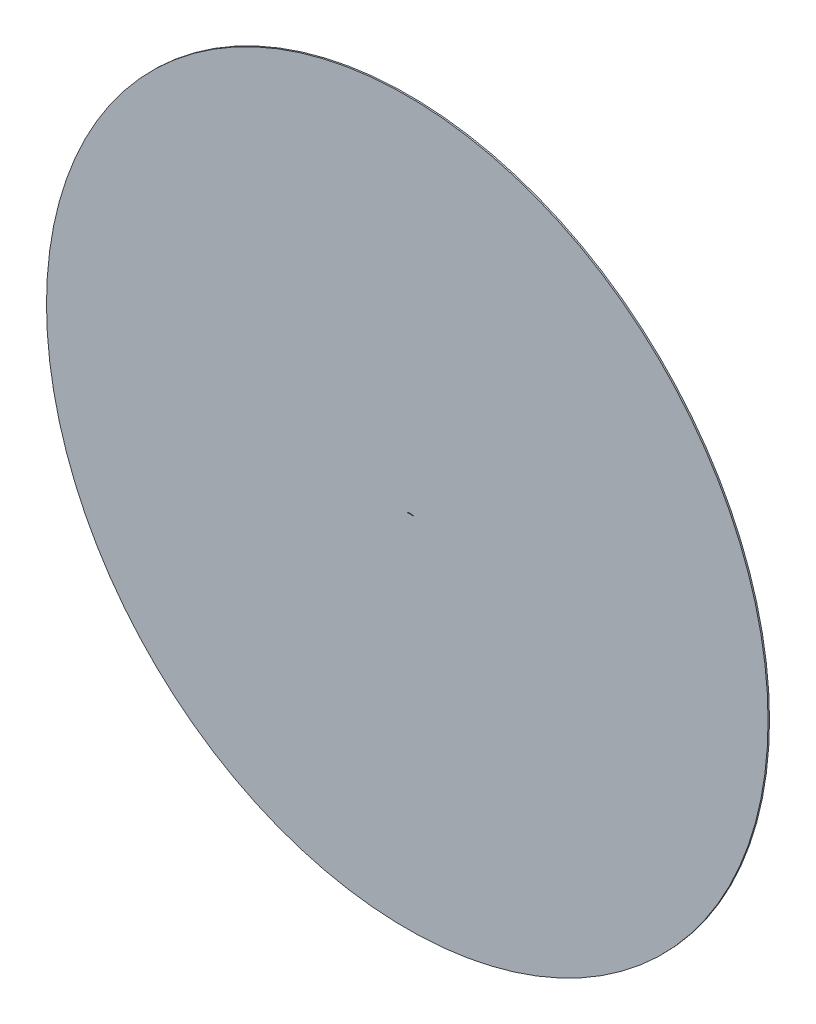
ISO-10303-21;
HEADER;
FILE_DESCRIPTION(('STEP AP214'),'2;1');
FILE_NAME('part.step','',(''),(''),'','','');
FILE_SCHEMA(('AUTOMOTIVE_DESIGN { 1 0 10303 214 1 1 1 1 }'));
ENDSEC;
DATA;
#1=APPLICATION_CONTEXT('core data for automotive mechanical design processes');
#2=APPLICATION_PROTOCOL_DEFINITION('international standard','automotive_design',2000,#1);
#3=PRODUCT_CONTEXT('',#1,'mechanical');
#4=PRODUCT('Part','Part','',(#3));
#5=PRODUCT_RELATED_PRODUCT_CATEGORY('part','',(#4));
#6=PRODUCT_DEFINITION_FORMATION('','',#4);
#7=PRODUCT_DEFINITION_CONTEXT('part definition',#1,'design');
#8=PRODUCT_DEFINITION('design','',#6,#7);
#9=PRODUCT_DEFINITION_SHAPE('','',#8);
#10=(LENGTH_UNIT() NAMED_UNIT(*) SI_UNIT(.MILLI.,.METRE.));
#11=(NAMED_UNIT(*) PLANE_ANGLE_UNIT() SI_UNIT($,.RADIAN.));
#12=(NAMED_UNIT(*) SI_UNIT($,.STERADIAN.) SOLID_ANGLE_UNIT());
#13=UNCERTAINTY_MEASURE_WITH_UNIT(LENGTH_MEASURE(1.E-05),#10,'distance_accuracy_value','');
#14=(GEOMETRIC_REPRESENTATION_CONTEXT(3) GLOBAL_UNCERTAINTY_ASSIGNED_CONTEXT((#13)) GLOBAL_UNIT_ASSIGNED_CONTEXT((#10,
#11,#12)) REPRESENTATION_CONTEXT('',''));
#15=CARTESIAN_POINT('',(0.,0.,0.));
#16=DIRECTION('',(0.,0.,1.));
#17=DIRECTION('',(1.,0.,0.));
#18=AXIS2_PLACEMENT_3D('',#15,#16,#17);
#19=CARTESIAN_POINT('',(0.,0.,30.));
#20=DIRECTION('',(0.,0.,1.));
#21=DIRECTION('',(1.,0.,0.));
#22=AXIS2_PLACEMENT_3D('',#19,#20,#21);
#23=PLANE('',#22);
#24=CARTESIAN_POINT('',(0.,0.,30.));
#25=DIRECTION('',(0.,0.,1.));
#26=DIRECTION('',(1.,0.,0.));
#27=AXIS2_PLACEMENT_3D('',#24,#25,#26);
#28=CIRCLE('',#27,15000.);
#29=CARTESIAN_POINT('',(15000.,0.,30.));
#30=VERTEX_POINT('',#29);
#31=EDGE_CURVE('E10',#30,#30,#28,.T.);
#32=ORIENTED_EDGE('',*,*,#31,.T.);
#33=EDGE_LOOP('',(#32));
#34=FACE_BOUND('',#33,.T.);
#35=CARTESIAN_POINT('',(300.,0.,30.));
#36=CARTESIAN_POINT('',(300.00040281126,0.0178912311711619,30.));
#37=CARTESIAN_POINT('',(297.856859750338,0.292445736117603,30.));
#38=CARTESIAN_POINT('',(295.723511165293,0.726892038601411,30.));
#39=CARTESIAN_POINT('',(290.679302282304,1.67948042122938,30.));
#40=CARTESIAN_POINT('',(284.635959686564,2.89737428072367,30.));
#41=CARTESIAN_POINT('',(276.87987904583,4.34451547557609,30.));
#42=CARTESIAN_POINT('',(267.820428047674,5.95277122047384,30.));
#43=CARTESIAN_POINT('',(257.455385672593,7.74224419698835,30.));
#44=CARTESIAN_POINT('',(245.967842138554,9.7066181298092,30.));
#45=CARTESIAN_POINT('',(233.506042755824,11.7912664082305,30.));
#46=CARTESIAN_POINT('',(220.251698882361,13.9739213882839,30.));
#47=CARTESIAN_POINT('',(206.381961989243,16.1816841890771,30.));
#48=CARTESIAN_POINT('',(192.087853073807,18.3684631142761,30.));
#49=CARTESIAN_POINT('',(177.558664746052,20.4566072205481,30.));
#50=CARTESIAN_POINT('',(162.970058246325,22.3599488554891,30.));
#51=CARTESIAN_POINT('',(148.455715133973,23.9244823538037,30.));
#52=CARTESIAN_POINT('',(134.124604137652,25.0697110511451,30.));
#53=CARTESIAN_POINT('',(120.062244475449,25.7341360546162,30.));
#54=CARTESIAN_POINT('',(106.348271384697,25.8979757807121,30.));
#55=CARTESIAN_POINT('',(93.0557110970717,25.5553915699274,30.));
#56=CARTESIAN_POINT('',(80.265928232374,24.7293055201625,30.));
#57=CARTESIAN_POINT('',(68.072226575361,23.5171246441329,30.));
#58=CARTESIAN_POINT('',(56.5871963367384,21.9624268561274,30.));
#59=CARTESIAN_POINT('',(45.9259917592067,20.1177795793824,30.));
#60=CARTESIAN_POINT('',(36.1959543757953,18.0184956263386,30.));
#61=CARTESIAN_POINT('',(27.4876628940928,15.7194579736335,30.));
#62=CARTESIAN_POINT('',(19.8855891908525,13.2615398947408,30.));
#63=CARTESIAN_POINT('',(13.4452540215748,10.6996038886315,30.));
#64=CARTESIAN_POINT('',(8.24407037225589,8.09833976542841,30.));
#65=CARTESIAN_POINT('',(4.22106589714552,5.54020578422956,30.));
#66=CARTESIAN_POINT('',(1.63133211564035,3.09036957768597,30.));
#67=CARTESIAN_POINT('',(-0.175553182759699,0.951021203870357,30.));
#68=CARTESIAN_POINT('',(0.24362162350237,-1.56434218405374,30.));
#69=CARTESIAN_POINT('',(2.94499584165738,-2.75652444092358,30.));
#70=CARTESIAN_POINT('',(6.53728526892577,-3.98019808086677,30.));
#71=CARTESIAN_POINT('',(11.8703670861722,-4.89179369343395,30.));
#72=CARTESIAN_POINT('',(18.6191428957802,-5.62028914467634,30.));
#73=CARTESIAN_POINT('',(26.8721866790343,-6.09035156959245,30.));
#74=CARTESIAN_POINT('',(36.521534761817,-6.33881410385371,30.));
#75=CARTESIAN_POINT('',(47.501784125513,-6.35678458321491,30.));
#76=CARTESIAN_POINT('',(59.7032435624576,-6.19345675329997,30.));
#77=CARTESIAN_POINT('',(73.0044392189791,-5.86958045111134,30.));
#78=CARTESIAN_POINT('',(87.2610974217293,-5.41976517230945,30.));
#79=CARTESIAN_POINT('',(102.313620517102,-4.87871635833439,30.));
#80=CARTESIAN_POINT('',(117.987122284178,-4.28221757864533,30.));
#81=CARTESIAN_POINT('',(134.096773033089,-3.66403242341421,30.));
#82=CARTESIAN_POINT('',(150.446415180609,-3.04805109691009,30.));
#83=CARTESIAN_POINT('',(166.83326988255,-2.46374879571803,30.));
#84=CARTESIAN_POINT('',(183.052252289696,-1.92822512908636,30.));
#85=CARTESIAN_POINT('',(198.901180903534,-1.45047651874413,30.));
#86=CARTESIAN_POINT('',(214.181407657856,-1.04799563782283,30.));
#87=CARTESIAN_POINT('',(228.699242300534,-0.713948731240478,30.));
#88=CARTESIAN_POINT('',(242.271153811748,-0.457646544877627,30.));
#89=CARTESIAN_POINT('',(254.717826147136,-0.266896562040738,30.));
#90=CARTESIAN_POINT('',(265.891722206891,-0.145076144092676,30.));
#91=CARTESIAN_POINT('',(275.612512850038,-0.058972976194312,30.));
#92=CARTESIAN_POINT('',(283.894928489289,0.0156210954300493,30.));
#93=CARTESIAN_POINT('',(290.305617376196,0.116640601254722,30.));
#94=CARTESIAN_POINT('',(295.596309521179,0.0899610797481541,30.));
#95=CARTESIAN_POINT('',(297.811219757919,0.119349423063566,30.));
#96=CARTESIAN_POINT('',(299.999594287493,-0.0180200926894571,30.));
#97=CARTESIAN_POINT('',(300.,0.,30.));
#98=B_SPLINE_CURVE_WITH_KNOTS('',3,(#35,#36,#37,#38,#39,#40,#41,#42,#43,#44,#45,#46,#47,#48,#49,
#50,#51,#52,#53,#54,#55,#56,#57,#58,#59,#60,#61,#62,#63,#64,#65,#66,#67,#68,#69,#70,#71,#72,#73,
#74,#75,#76,#77,#78,#79,#80,#81,#82,#83,#84,#85,#86,#87,#88,#89,#90,#91,#92,#93,#94,#95,#96,
#97),.UNSPECIFIED.,.T.,.F.,(4,1,1,1,1,1,1,1,1,1,1,1,1,1,1,1,1,1,1,1,1,1,1,1,1,1,1,1,1,1,1,1,1,1,
1,1,1,1,1,1,1,1,1,1,1,1,1,1,1,1,1,1,1,1,1,1,1,1,1,1,4),(0.,0.00168729220087391,
0.00661588248411182,0.0144655580179595,0.0249241981499137,0.0377997085441562,0.0529884695039723,
0.0703168037250743,0.0895351086225911,0.110360248029101,0.132501123331061,0.155650768536403,
0.179484174254932,0.203672901941004,0.227895236953345,0.251892314116109,0.275516864504099,
0.29864528379615,0.321169244807871,0.343005232415743,0.364074692895285,0.384236026199413,
0.403304982230054,0.421105994965221,0.437475164698584,0.452282795180976,0.465414650390337,
0.476784492986743,0.486339783512584,0.494068892828919,0.499998920706757,0.50417047164572,
0.50699716321139,0.511089714620469,0.517452454166951,0.526208560994422,0.53739170236706,
0.550962222745954,0.56684131768037,0.584909639607616,0.604997386010049,0.626900912127429,
0.650394480538586,0.675201621876447,0.701035251973763,0.727593371026262,0.75454969106252,
0.781563238843302,0.808298626444608,0.834420906260716,0.859605071481756,0.883531629396658,
0.905895720386451,0.926412444949588,0.944811580614751,0.960857577393262,0.974373752859433,
0.985246767366716,0.993303880701925,0.998300555084048,1.),.UNSPECIFIED.);
#99=CARTESIAN_POINT('',(300.,0.,30.));
#100=VERTEX_POINT('',#99);
#101=EDGE_CURVE('E42',#100,#100,#98,.T.);
#102=ORIENTED_EDGE('',*,*,#101,.F.);
#103=EDGE_LOOP('',(#102));
#104=FACE_BOUND('',#103,.T.);
#105=ADVANCED_FACE('F31',(#34,#104),#23,.T.);
#106=CARTESIAN_POINT('',(0.,0.,-30.));
#107=DIRECTION('',(0.,0.,1.));
#108=DIRECTION('',(1.,0.,0.));
#109=AXIS2_PLACEMENT_3D('',#106,#107,#108);
#110=PLANE('',#109);
#111=CARTESIAN_POINT('',(0.,0.,-30.));
#112=DIRECTION('',(0.,0.,1.));
#113=DIRECTION('',(1.,0.,0.));
#114=AXIS2_PLACEMENT_3D('',#111,#112,#113);
#115=CIRCLE('',#114,15000.);
#116=CARTESIAN_POINT('',(15000.,0.,-30.));
#117=VERTEX_POINT('',#116);
#118=EDGE_CURVE('E35',#117,#117,#115,.T.);
#119=ORIENTED_EDGE('',*,*,#118,.F.);
#120=EDGE_LOOP('',(#119));
#121=FACE_BOUND('',#120,.T.);
#122=CARTESIAN_POINT('',(300.,0.,-30.));
#123=CARTESIAN_POINT('',(300.00040281126,0.0178912311711619,-30.));
#124=CARTESIAN_POINT('',(297.856859750338,0.292445736117603,-30.));
#125=CARTESIAN_POINT('',(295.723511165293,0.726892038601411,-30.));
#126=CARTESIAN_POINT('',(290.679302282304,1.67948042122938,-30.));
#127=CARTESIAN_POINT('',(284.635959686564,2.89737428072367,-30.));
#128=CARTESIAN_POINT('',(276.87987904583,4.34451547557609,-30.));
#129=CARTESIAN_POINT('',(267.820428047674,5.95277122047384,-30.));
#130=CARTESIAN_POINT('',(257.455385672593,7.74224419698835,-30.));
#131=CARTESIAN_POINT('',(245.967842138554,9.7066181298092,-30.));
#132=CARTESIAN_POINT('',(233.506042755824,11.7912664082305,-30.));
#133=CARTESIAN_POINT('',(220.251698882361,13.9739213882839,-30.));
#134=CARTESIAN_POINT('',(206.381961989243,16.1816841890771,-30.));
#135=CARTESIAN_POINT('',(192.087853073807,18.3684631142761,-30.));
#136=CARTESIAN_POINT('',(177.558664746052,20.4566072205481,-30.));
#137=CARTESIAN_POINT('',(162.970058246325,22.3599488554891,-30.));
#138=CARTESIAN_POINT('',(148.455715133973,23.9244823538037,-30.));
#139=CARTESIAN_POINT('',(134.124604137652,25.0697110511451,-30.));
#140=CARTESIAN_POINT('',(120.062244475449,25.7341360546162,-30.));
#141=CARTESIAN_POINT('',(106.348271384697,25.8979757807121,-30.));
#142=CARTESIAN_POINT('',(93.0557110970717,25.5553915699274,-30.));
#143=CARTESIAN_POINT('',(80.265928232374,24.7293055201625,-30.));
#144=CARTESIAN_POINT('',(68.072226575361,23.5171246441329,-30.));
#145=CARTESIAN_POINT('',(56.5871963367384,21.9624268561274,-30.));
#146=CARTESIAN_POINT('',(45.9259917592067,20.1177795793824,-30.));
#147=CARTESIAN_POINT('',(36.1959543757953,18.0184956263386,-30.));
#148=CARTESIAN_POINT('',(27.4876628940928,15.7194579736335,-30.));
#149=CARTESIAN_POINT('',(19.8855891908525,13.2615398947408,-30.));
#150=CARTESIAN_POINT('',(13.4452540215748,10.6996038886315,-30.));
#151=CARTESIAN_POINT('',(8.24407037225589,8.09833976542841,-30.));
#152=CARTESIAN_POINT('',(4.22106589714552,5.54020578422956,-30.));
#153=CARTESIAN_POINT('',(1.63133211564035,3.09036957768597,-30.));
#154=CARTESIAN_POINT('',(-0.175553182759699,0.951021203870357,-30.));
#155=CARTESIAN_POINT('',(0.24362162350237,-1.56434218405374,-30.));
#156=CARTESIAN_POINT('',(2.94499584165738,-2.75652444092358,-30.));
#157=CARTESIAN_POINT('',(6.53728526892577,-3.98019808086677,-30.));
#158=CARTESIAN_POINT('',(11.8703670861722,-4.89179369343395,-30.));
#159=CARTESIAN_POINT('',(18.6191428957802,-5.62028914467634,-30.));
#160=CARTESIAN_POINT('',(26.8721866790343,-6.09035156959245,-30.));
#161=CARTESIAN_POINT('',(36.521534761817,-6.33881410385371,-30.));
#162=CARTESIAN_POINT('',(47.501784125513,-6.35678458321491,-30.));
#163=CARTESIAN_POINT('',(59.7032435624576,-6.19345675329997,-30.));
#164=CARTESIAN_POINT('',(73.0044392189791,-5.86958045111134,-30.));
#165=CARTESIAN_POINT('',(87.2610974217293,-5.41976517230945,-30.));
#166=CARTESIAN_POINT('',(102.313620517102,-4.87871635833439,-30.));
#167=CARTESIAN_POINT('',(117.987122284178,-4.28221757864533,-30.));
#168=CARTESIAN_POINT('',(134.096773033089,-3.66403242341421,-30.));
#169=CARTESIAN_POINT('',(150.446415180609,-3.04805109691009,-30.));
#170=CARTESIAN_POINT('',(166.83326988255,-2.46374879571803,-30.));
#171=CARTESIAN_POINT('',(183.052252289696,-1.92822512908636,-30.));
#172=CARTESIAN_POINT('',(198.901180903534,-1.45047651874413,-30.));
#173=CARTESIAN_POINT('',(214.181407657856,-1.04799563782283,-30.));
#174=CARTESIAN_POINT('',(228.699242300534,-0.713948731240478,-30.));
#175=CARTESIAN_POINT('',(242.271153811748,-0.457646544877627,-30.));
#176=CARTESIAN_POINT('',(254.717826147136,-0.266896562040738,-30.));
#177=CARTESIAN_POINT('',(265.891722206891,-0.145076144092676,-30.));
#178=CARTESIAN_POINT('',(275.612512850038,-0.058972976194312,-30.));
#179=CARTESIAN_POINT('',(283.894928489289,0.0156210954300493,-30.));
#180=CARTESIAN_POINT('',(290.305617376196,0.116640601254722,-30.));
#181=CARTESIAN_POINT('',(295.596309521179,0.0899610797481541,-30.));
#182=CARTESIAN_POINT('',(297.811219757919,0.119349423063566,-30.));
#183=CARTESIAN_POINT('',(299.999594287493,-0.0180200926894571,-30.));
#184=CARTESIAN_POINT('',(300.,0.,-30.));
#185=B_SPLINE_CURVE_WITH_KNOTS('',3,(#122,#123,#124,#125,#126,#127,#128,#129,#130,#131,#132,
#133,#134,#135,#136,#137,#138,#139,#140,#141,#142,#143,#144,#145,#146,#147,#148,#149,#150,#151,
#152,#153,#154,#155,#156,#157,#158,#159,#160,#161,#162,#163,#164,#165,#166,#167,#168,#169,#170,
#171,#172,#173,#174,#175,#176,#177,#178,#179,#180,#181,#182,#183,#184),.UNSPECIFIED.,.T.,.F.,(4,
1,1,1,1,1,1,1,1,1,1,1,1,1,1,1,1,1,1,1,1,1,1,1,1,1,1,1,1,1,1,1,1,1,1,1,1,1,1,1,1,1,1,1,1,1,1,1,1,
1,1,1,1,1,1,1,1,1,1,1,4),(0.,0.00168729220087391,0.00661588248411182,0.0144655580179595,
0.0249241981499137,0.0377997085441562,0.0529884695039723,0.0703168037250743,0.0895351086225911,
0.110360248029101,0.132501123331061,0.155650768536403,0.179484174254932,0.203672901941004,
0.227895236953345,0.251892314116109,0.275516864504099,0.29864528379615,0.321169244807871,
0.343005232415743,0.364074692895285,0.384236026199413,0.403304982230054,0.421105994965221,
0.437475164698584,0.452282795180976,0.465414650390337,0.476784492986743,0.486339783512584,
0.494068892828919,0.499998920706757,0.50417047164572,0.50699716321139,0.511089714620469,
0.517452454166951,0.526208560994422,0.53739170236706,0.550962222745954,0.56684131768037,
0.584909639607616,0.604997386010049,0.626900912127429,0.650394480538586,0.675201621876447,
0.701035251973763,0.727593371026262,0.75454969106252,0.781563238843302,0.808298626444608,
0.834420906260716,0.859605071481756,0.883531629396658,0.905895720386451,0.926412444949588,
0.944811580614751,0.960857577393262,0.974373752859433,0.985246767366716,0.993303880701925,
0.998300555084048,1.),.UNSPECIFIED.);
#186=CARTESIAN_POINT('',(300.,0.,-30.));
#187=VERTEX_POINT('',#186);
#188=EDGE_CURVE('E44',#187,#187,#185,.T.);
#189=ORIENTED_EDGE('',*,*,#188,.T.);
#190=EDGE_LOOP('',(#189));
#191=FACE_BOUND('',#190,.T.);
#192=ADVANCED_FACE('F65',(#121,#191),#110,.F.);
#193=CARTESIAN_POINT('',(0.,0.,30.));
#194=DIRECTION('',(0.,0.,-1.));
#195=DIRECTION('',(-1.,0.,0.));
#196=AXIS2_PLACEMENT_3D('',#193,#194,#195);
#197=CYLINDRICAL_SURFACE('',#196,15000.);
#198=ORIENTED_EDGE('',*,*,#31,.F.);
#199=EDGE_LOOP('',(#198));
#200=FACE_BOUND('',#199,.T.);
#201=ORIENTED_EDGE('',*,*,#118,.T.);
#202=EDGE_LOOP('',(#201));
#203=FACE_BOUND('',#202,.T.);
#204=ADVANCED_FACE('F33',(#200,#203),#197,.T.);
#205=DIRECTION('',(0.,0.,-1.));
#206=VECTOR('',#205,1.);
#207=SURFACE_OF_LINEAR_EXTRUSION('',#98,#206);
#208=ORIENTED_EDGE('',*,*,#101,.T.);
#209=EDGE_LOOP('',(#208));
#210=FACE_BOUND('',#209,.T.);
#211=ORIENTED_EDGE('',*,*,#188,.F.);
#212=EDGE_LOOP('',(#211));
#213=FACE_BOUND('',#212,.T.);
#214=ADVANCED_FACE('F60',(#210,#213),#207,.T.);
#215=CLOSED_SHELL('',(#105,#192,#204,#214));
#216=MANIFOLD_SOLID_BREP('B2',#215);
#217=ADVANCED_BREP_SHAPE_REPRESENTATION('',(#18,#216),#14);
#218=SHAPE_DEFINITION_REPRESENTATION(#9,#217);
ENDSEC;
END-ISO-10303-21;
